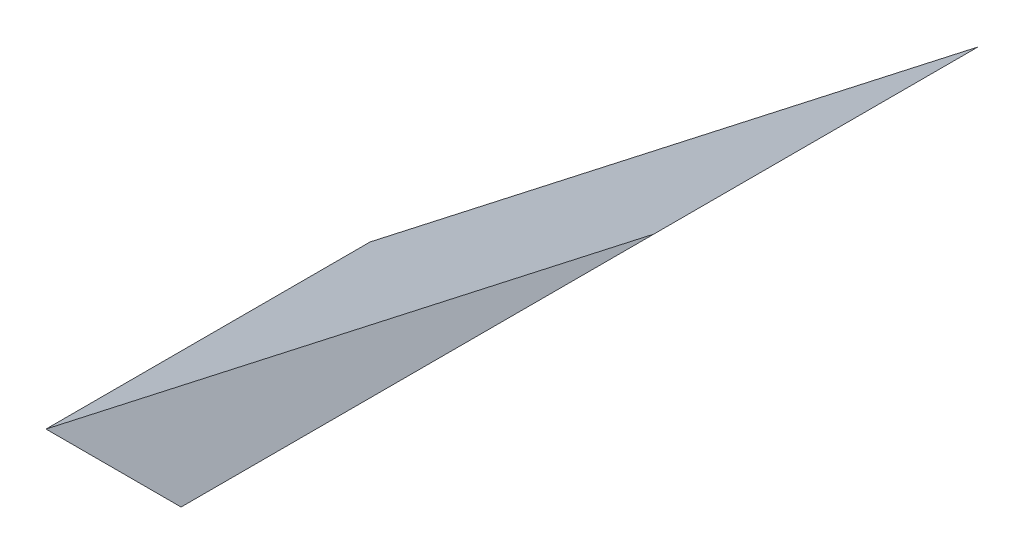
ISO-10303-21;
HEADER;
FILE_DESCRIPTION(('STEP AP214'),'2;1');
FILE_NAME('part.step','',(''),(''),'','','');
FILE_SCHEMA(('AUTOMOTIVE_DESIGN { 1 0 10303 214 1 1 1 1 }'));
ENDSEC;
DATA;
#1=APPLICATION_CONTEXT('core data for automotive mechanical design processes');
#2=APPLICATION_PROTOCOL_DEFINITION('international standard','automotive_design',2000,#1);
#3=PRODUCT_CONTEXT('',#1,'mechanical');
#4=PRODUCT('Part','Part','',(#3));
#5=PRODUCT_RELATED_PRODUCT_CATEGORY('part','',(#4));
#6=PRODUCT_DEFINITION_FORMATION('','',#4);
#7=PRODUCT_DEFINITION_CONTEXT('part definition',#1,'design');
#8=PRODUCT_DEFINITION('design','',#6,#7);
#9=PRODUCT_DEFINITION_SHAPE('','',#8);
#10=(LENGTH_UNIT() NAMED_UNIT(*) SI_UNIT(.MILLI.,.METRE.));
#11=(NAMED_UNIT(*) PLANE_ANGLE_UNIT() SI_UNIT($,.RADIAN.));
#12=(NAMED_UNIT(*) SI_UNIT($,.STERADIAN.) SOLID_ANGLE_UNIT());
#13=UNCERTAINTY_MEASURE_WITH_UNIT(LENGTH_MEASURE(1.E-05),#10,'distance_accuracy_value','');
#14=(GEOMETRIC_REPRESENTATION_CONTEXT(3) GLOBAL_UNCERTAINTY_ASSIGNED_CONTEXT((#13)) GLOBAL_UNIT_ASSIGNED_CONTEXT((#10,
#11,#12)) REPRESENTATION_CONTEXT('',''));
#15=CARTESIAN_POINT('',(0.,0.,0.));
#16=DIRECTION('',(0.,0.,1.));
#17=DIRECTION('',(1.,0.,0.));
#18=AXIS2_PLACEMENT_3D('',#15,#16,#17);
#19=CARTESIAN_POINT('',(0.714375,0.555625,0.));
#20=DIRECTION('',(0.707106781186548,-0.707106781186548,0.));
#21=DIRECTION('',(0.707106781186548,0.707106781186548,0.));
#22=AXIS2_PLACEMENT_3D('',#19,#20,#21);
#23=PLANE('',#22);
#24=DIRECTION('',(0.,0.,-1.));
#25=VECTOR('',#24,1.);
#26=CARTESIAN_POINT('',(-0.396875,-0.555625,0.));
#27=LINE('',#26,#25);
#28=CARTESIAN_POINT('',(-0.396875,-0.555625,0.));
#29=VERTEX_POINT('',#28);
#30=CARTESIAN_POINT('',(-0.396875,-0.555625,0.762));
#31=VERTEX_POINT('',#30);
#32=EDGE_CURVE('E47',#29,#31,#27,.F.);
#33=ORIENTED_EDGE('',*,*,#32,.F.);
#34=DIRECTION('',(0.707106781186547,0.707106781186548,0.));
#35=VECTOR('',#34,1.);
#36=CARTESIAN_POINT('',(-0.396875,-0.555625,0.));
#37=LINE('',#36,#35);
#38=CARTESIAN_POINT('',(0.714374999999924,0.555625000000092,0.));
#39=VERTEX_POINT('',#38);
#40=EDGE_CURVE('E66',#29,#39,#37,.T.);
#41=ORIENTED_EDGE('',*,*,#40,.T.);
#42=DIRECTION('',(0.,0.,1.));
#43=VECTOR('',#42,1.);
#44=CARTESIAN_POINT('',(0.714375,0.555625,0.));
#45=LINE('',#44,#43);
#46=CARTESIAN_POINT('',(0.714374999999924,0.555625000000092,0.762));
#47=VERTEX_POINT('',#46);
#48=EDGE_CURVE('E20',#39,#47,#45,.T.);
#49=ORIENTED_EDGE('',*,*,#48,.T.);
#50=DIRECTION('',(0.707106781186547,0.707106781186548,0.));
#51=VECTOR('',#50,1.);
#52=CARTESIAN_POINT('',(-0.396875,-0.555625,0.762));
#53=LINE('',#52,#51);
#54=EDGE_CURVE('E58',#31,#47,#53,.T.);
#55=ORIENTED_EDGE('',*,*,#54,.F.);
#56=EDGE_LOOP('',(#33,#41,#49,#55));
#57=FACE_BOUND('',#56,.T.);
#58=ADVANCED_FACE('F17',(#57),#23,.T.);
#59=CARTESIAN_POINT('',(-0.396875,-0.555625,0.));
#60=DIRECTION('',(0.,-1.,0.));
#61=DIRECTION('',(0.,0.,-1.));
#62=AXIS2_PLACEMENT_3D('',#59,#60,#61);
#63=PLANE('',#62);
#64=DIRECTION('',(0.,0.,1.));
#65=VECTOR('',#64,1.);
#66=CARTESIAN_POINT('',(-0.714375,-0.555625,0.));
#67=LINE('',#66,#65);
#68=CARTESIAN_POINT('',(-0.714375,-0.555625,0.));
#69=VERTEX_POINT('',#68);
#70=CARTESIAN_POINT('',(-0.714375,-0.555625,0.762));
#71=VERTEX_POINT('',#70);
#72=EDGE_CURVE('E68',#69,#71,#67,.T.);
#73=ORIENTED_EDGE('',*,*,#72,.F.);
#74=DIRECTION('',(1.,0.,0.));
#75=VECTOR('',#74,1.);
#76=CARTESIAN_POINT('',(0.714375,-0.555625,0.));
#77=LINE('',#76,#75);
#78=EDGE_CURVE('E55',#69,#29,#77,.T.);
#79=ORIENTED_EDGE('',*,*,#78,.T.);
#80=ORIENTED_EDGE('',*,*,#32,.T.);
#81=DIRECTION('',(1.,0.,0.));
#82=VECTOR('',#81,1.);
#83=CARTESIAN_POINT('',(0.714375,-0.555625,0.762));
#84=LINE('',#83,#82);
#85=EDGE_CURVE('E52',#71,#31,#84,.T.);
#86=ORIENTED_EDGE('',*,*,#85,.F.);
#87=EDGE_LOOP('',(#73,#79,#80,#86));
#88=FACE_BOUND('',#87,.T.);
#89=ADVANCED_FACE('F50',(#88),#63,.T.);
#90=CARTESIAN_POINT('',(0.714375,0.555625,0.762));
#91=DIRECTION('',(0.,0.,1.));
#92=DIRECTION('',(1.,0.,0.));
#93=AXIS2_PLACEMENT_3D('',#90,#91,#92);
#94=PLANE('',#93);
#95=ORIENTED_EDGE('',*,*,#85,.T.);
#96=ORIENTED_EDGE('',*,*,#54,.T.);
#97=DIRECTION('',(-0.789352217376165,-0.613940613515128,0.));
#98=VECTOR('',#97,1.);
#99=CARTESIAN_POINT('',(-0.714375,-0.555625,0.762));
#100=LINE('',#99,#98);
#101=EDGE_CURVE('E26',#71,#47,#100,.F.);
#102=ORIENTED_EDGE('',*,*,#101,.F.);
#103=EDGE_LOOP('',(#95,#96,#102));
#104=FACE_BOUND('',#103,.T.);
#105=ADVANCED_FACE('F61',(#104),#94,.T.);
#106=CARTESIAN_POINT('',(0.714375,0.555625,0.));
#107=DIRECTION('',(0.,0.,1.));
#108=DIRECTION('',(1.,0.,0.));
#109=AXIS2_PLACEMENT_3D('',#106,#107,#108);
#110=PLANE('',#109);
#111=ORIENTED_EDGE('',*,*,#78,.F.);
#112=DIRECTION('',(-0.789352217376165,-0.613940613515128,0.));
#113=VECTOR('',#112,1.);
#114=CARTESIAN_POINT('',(-0.714375,-0.555625,0.));
#115=LINE('',#114,#113);
#116=EDGE_CURVE('E11',#39,#69,#115,.T.);
#117=ORIENTED_EDGE('',*,*,#116,.F.);
#118=ORIENTED_EDGE('',*,*,#40,.F.);
#119=EDGE_LOOP('',(#111,#117,#118));
#120=FACE_BOUND('',#119,.T.);
#121=ADVANCED_FACE('F73',(#120),#110,.F.);
#122=CARTESIAN_POINT('',(-0.714375,-0.555625,0.));
#123=DIRECTION('',(-0.613940613515128,0.789352217376165,0.));
#124=DIRECTION('',(-0.789352217376165,-0.613940613515128,0.));
#125=AXIS2_PLACEMENT_3D('',#122,#123,#124);
#126=PLANE('',#125);
#127=ORIENTED_EDGE('',*,*,#48,.F.);
#128=ORIENTED_EDGE('',*,*,#116,.T.);
#129=ORIENTED_EDGE('',*,*,#72,.T.);
#130=ORIENTED_EDGE('',*,*,#101,.T.);
#131=EDGE_LOOP('',(#127,#128,#129,#130));
#132=FACE_BOUND('',#131,.T.);
#133=ADVANCED_FACE('F70',(#132),#126,.T.);
#134=CLOSED_SHELL('',(#58,#89,#105,#121,#133));
#135=MANIFOLD_SOLID_BREP('B1',#134);
#136=ADVANCED_BREP_SHAPE_REPRESENTATION('',(#18,#135),#14);
#137=SHAPE_DEFINITION_REPRESENTATION(#9,#136);
ENDSEC;
END-ISO-10303-21;
